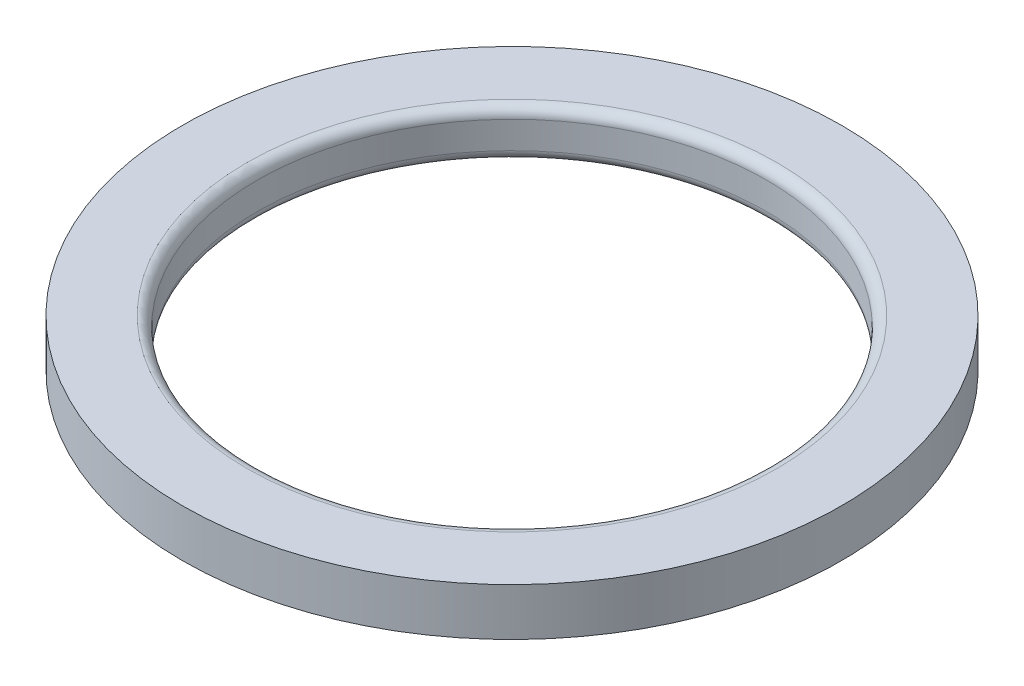
ISO-10303-21;
HEADER;
FILE_DESCRIPTION(('STEP AP214'),'2;1');
FILE_NAME('part.step','',(''),(''),'','','');
FILE_SCHEMA(('AUTOMOTIVE_DESIGN { 1 0 10303 214 1 1 1 1 }'));
ENDSEC;
DATA;
#1=APPLICATION_CONTEXT('core data for automotive mechanical design processes');
#2=APPLICATION_PROTOCOL_DEFINITION('international standard','automotive_design',2000,#1);
#3=PRODUCT_CONTEXT('',#1,'mechanical');
#4=PRODUCT('Part','Part','',(#3));
#5=PRODUCT_RELATED_PRODUCT_CATEGORY('part','',(#4));
#6=PRODUCT_DEFINITION_FORMATION('','',#4);
#7=PRODUCT_DEFINITION_CONTEXT('part definition',#1,'design');
#8=PRODUCT_DEFINITION('design','',#6,#7);
#9=PRODUCT_DEFINITION_SHAPE('','',#8);
#10=(LENGTH_UNIT() NAMED_UNIT(*) SI_UNIT(.MILLI.,.METRE.));
#11=(NAMED_UNIT(*) PLANE_ANGLE_UNIT() SI_UNIT($,.RADIAN.));
#12=(NAMED_UNIT(*) SI_UNIT($,.STERADIAN.) SOLID_ANGLE_UNIT());
#13=UNCERTAINTY_MEASURE_WITH_UNIT(LENGTH_MEASURE(1.E-05),#10,'distance_accuracy_value','');
#14=(GEOMETRIC_REPRESENTATION_CONTEXT(3) GLOBAL_UNCERTAINTY_ASSIGNED_CONTEXT((#13)) GLOBAL_UNIT_ASSIGNED_CONTEXT((#10,
#11,#12)) REPRESENTATION_CONTEXT('',''));
#15=CARTESIAN_POINT('',(0.,0.,0.));
#16=DIRECTION('',(0.,0.,1.));
#17=DIRECTION('',(1.,0.,0.));
#18=AXIS2_PLACEMENT_3D('',#15,#16,#17);
#19=CARTESIAN_POINT('',(0.,1.4,0.));
#20=DIRECTION('',(0.,1.,0.));
#21=DIRECTION('',(0.,0.,1.));
#22=AXIS2_PLACEMENT_3D('',#19,#20,#21);
#23=PLANE('',#22);
#24=CARTESIAN_POINT('',(0.,1.4,0.));
#25=DIRECTION('',(0.,1.,0.));
#26=DIRECTION('',(0.,0.,1.));
#27=AXIS2_PLACEMENT_3D('',#24,#25,#26);
#28=CIRCLE('',#27,7.8);
#29=CARTESIAN_POINT('',(0.,1.4,7.8));
#30=VERTEX_POINT('',#29);
#31=EDGE_CURVE('E10',#30,#30,#28,.F.);
#32=ORIENTED_EDGE('',*,*,#31,.T.);
#33=EDGE_LOOP('',(#32));
#34=FACE_BOUND('',#33,.T.);
#35=CARTESIAN_POINT('',(0.,1.4,0.));
#36=DIRECTION('',(0.,1.,0.));
#37=DIRECTION('',(0.,0.,1.));
#38=AXIS2_PLACEMENT_3D('',#35,#36,#37);
#39=CIRCLE('',#38,9.7);
#40=CARTESIAN_POINT('',(0.,1.4,9.7));
#41=VERTEX_POINT('',#40);
#42=EDGE_CURVE('E52',#41,#41,#39,.T.);
#43=ORIENTED_EDGE('',*,*,#42,.T.);
#44=EDGE_LOOP('',(#43));
#45=FACE_BOUND('',#44,.T.);
#46=ADVANCED_FACE('F32',(#34,#45),#23,.T.);
#47=CARTESIAN_POINT('',(0.,0.,0.));
#48=DIRECTION('',(0.,1.,0.));
#49=DIRECTION('',(0.,0.,1.));
#50=AXIS2_PLACEMENT_3D('',#47,#48,#49);
#51=PLANE('',#50);
#52=CARTESIAN_POINT('',(0.,0.,0.));
#53=DIRECTION('',(0.,1.,0.));
#54=DIRECTION('',(0.,0.,1.));
#55=AXIS2_PLACEMENT_3D('',#52,#53,#54);
#56=CIRCLE('',#55,7.8);
#57=CARTESIAN_POINT('',(0.,0.,7.8));
#58=VERTEX_POINT('',#57);
#59=EDGE_CURVE('E47',#58,#58,#56,.T.);
#60=ORIENTED_EDGE('',*,*,#59,.T.);
#61=EDGE_LOOP('',(#60));
#62=FACE_BOUND('',#61,.T.);
#63=CARTESIAN_POINT('',(0.,0.,0.));
#64=DIRECTION('',(0.,1.,0.));
#65=DIRECTION('',(0.,0.,1.));
#66=AXIS2_PLACEMENT_3D('',#63,#64,#65);
#67=CIRCLE('',#66,9.7);
#68=CARTESIAN_POINT('',(0.,0.,9.7));
#69=VERTEX_POINT('',#68);
#70=EDGE_CURVE('E53',#69,#69,#67,.T.);
#71=ORIENTED_EDGE('',*,*,#70,.F.);
#72=EDGE_LOOP('',(#71));
#73=FACE_BOUND('',#72,.T.);
#74=ADVANCED_FACE('F64',(#62,#73),#51,.F.);
#75=CARTESIAN_POINT('',(0.,1.4,0.));
#76=DIRECTION('',(0.,-1.,0.));
#77=DIRECTION('',(0.,0.,-1.));
#78=AXIS2_PLACEMENT_3D('',#75,#76,#77);
#79=CYLINDRICAL_SURFACE('',#78,9.7);
#80=ORIENTED_EDGE('',*,*,#42,.F.);
#81=EDGE_LOOP('',(#80));
#82=FACE_BOUND('',#81,.T.);
#83=ORIENTED_EDGE('',*,*,#70,.T.);
#84=EDGE_LOOP('',(#83));
#85=FACE_BOUND('',#84,.T.);
#86=ADVANCED_FACE('F60',(#82,#85),#79,.T.);
#87=CARTESIAN_POINT('',(0.,1.4,0.));
#88=DIRECTION('',(0.,-1.,0.));
#89=DIRECTION('',(0.,0.,-1.));
#90=AXIS2_PLACEMENT_3D('',#87,#88,#89);
#91=CYLINDRICAL_SURFACE('',#90,7.5);
#92=CARTESIAN_POINT('',(0.,0.3,0.));
#93=DIRECTION('',(0.,1.,0.));
#94=DIRECTION('',(0.,0.,1.));
#95=AXIS2_PLACEMENT_3D('',#92,#93,#94);
#96=CIRCLE('',#95,7.5);
#97=CARTESIAN_POINT('',(0.,0.3,7.5));
#98=VERTEX_POINT('',#97);
#99=EDGE_CURVE('E39',#98,#98,#96,.F.);
#100=ORIENTED_EDGE('',*,*,#99,.T.);
#101=EDGE_LOOP('',(#100));
#102=FACE_BOUND('',#101,.T.);
#103=CARTESIAN_POINT('',(0.,1.1,0.));
#104=DIRECTION('',(0.,1.,0.));
#105=DIRECTION('',(0.,0.,1.));
#106=AXIS2_PLACEMENT_3D('',#103,#104,#105);
#107=CIRCLE('',#106,7.5);
#108=CARTESIAN_POINT('',(0.,1.1,7.5));
#109=VERTEX_POINT('',#108);
#110=EDGE_CURVE('E43',#109,#109,#107,.T.);
#111=ORIENTED_EDGE('',*,*,#110,.T.);
#112=EDGE_LOOP('',(#111));
#113=FACE_BOUND('',#112,.T.);
#114=ADVANCED_FACE('F63',(#102,#113),#91,.F.);
#115=CARTESIAN_POINT('',(0.,0.3,0.));
#116=DIRECTION('',(0.,1.,0.));
#117=DIRECTION('',(0.,0.,1.));
#118=AXIS2_PLACEMENT_3D('',#115,#116,#117);
#119=TOROIDAL_SURFACE('',#118,7.8,0.3);
#120=ORIENTED_EDGE('',*,*,#99,.F.);
#121=EDGE_LOOP('',(#120));
#122=FACE_BOUND('',#121,.T.);
#123=ORIENTED_EDGE('',*,*,#59,.F.);
#124=EDGE_LOOP('',(#123));
#125=FACE_BOUND('',#124,.T.);
#126=ADVANCED_FACE('F76',(#122,#125),#119,.T.);
#127=CARTESIAN_POINT('',(0.,1.1,0.));
#128=DIRECTION('',(0.,1.,0.));
#129=DIRECTION('',(0.,0.,1.));
#130=AXIS2_PLACEMENT_3D('',#127,#128,#129);
#131=TOROIDAL_SURFACE('',#130,7.8,0.3);
#132=ORIENTED_EDGE('',*,*,#31,.F.);
#133=EDGE_LOOP('',(#132));
#134=FACE_BOUND('',#133,.T.);
#135=ORIENTED_EDGE('',*,*,#110,.F.);
#136=EDGE_LOOP('',(#135));
#137=FACE_BOUND('',#136,.T.);
#138=ADVANCED_FACE('F34',(#134,#137),#131,.T.);
#139=CLOSED_SHELL('',(#46,#74,#86,#114,#126,#138));
#140=MANIFOLD_SOLID_BREP('B2',#139);
#141=ADVANCED_BREP_SHAPE_REPRESENTATION('',(#18,#140),#14);
#142=SHAPE_DEFINITION_REPRESENTATION(#9,#141);
ENDSEC;
END-ISO-10303-21;
